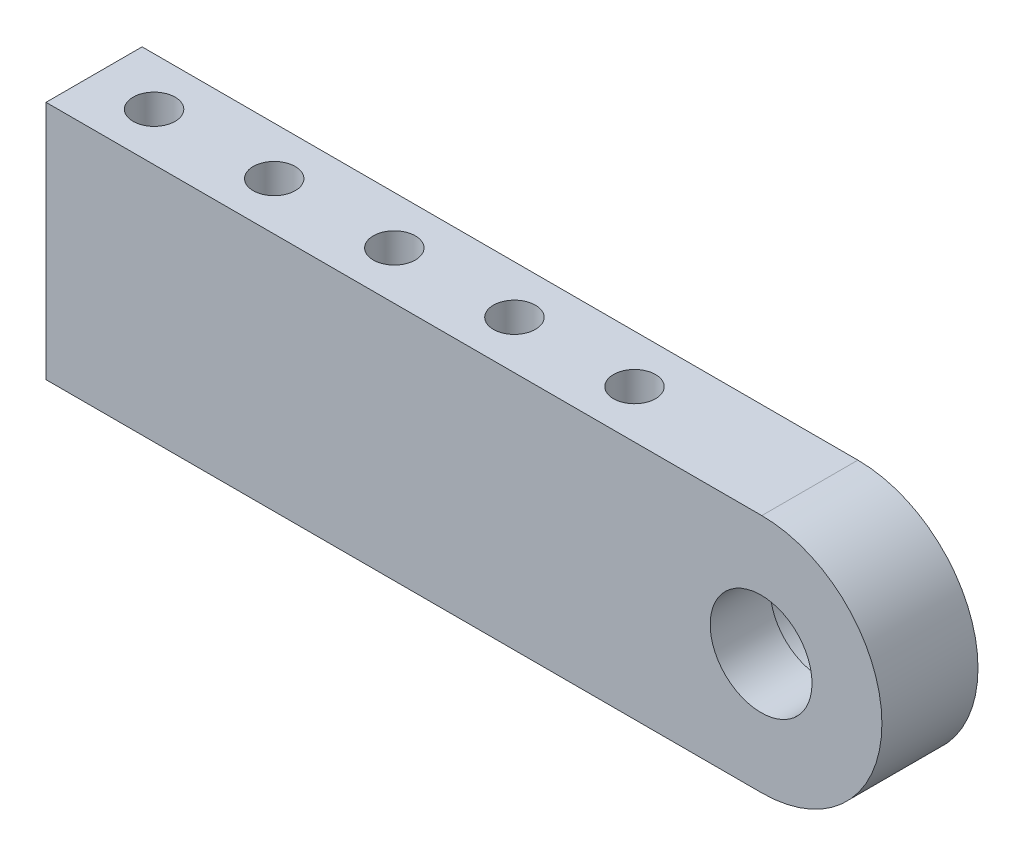
ISO-10303-21;
HEADER;
FILE_DESCRIPTION(('STEP AP214'),'2;1');
FILE_NAME('part.step','',(''),(''),'','','');
FILE_SCHEMA(('AUTOMOTIVE_DESIGN { 1 0 10303 214 1 1 1 1 }'));
ENDSEC;
DATA;
#1=APPLICATION_CONTEXT('core data for automotive mechanical design processes');
#2=APPLICATION_PROTOCOL_DEFINITION('international standard','automotive_design',2000,#1);
#3=PRODUCT_CONTEXT('',#1,'mechanical');
#4=PRODUCT('Part','Part','',(#3));
#5=PRODUCT_RELATED_PRODUCT_CATEGORY('part','',(#4));
#6=PRODUCT_DEFINITION_FORMATION('','',#4);
#7=PRODUCT_DEFINITION_CONTEXT('part definition',#1,'design');
#8=PRODUCT_DEFINITION('design','',#6,#7);
#9=PRODUCT_DEFINITION_SHAPE('','',#8);
#10=(LENGTH_UNIT() NAMED_UNIT(*) SI_UNIT(.MILLI.,.METRE.));
#11=(NAMED_UNIT(*) PLANE_ANGLE_UNIT() SI_UNIT($,.RADIAN.));
#12=(NAMED_UNIT(*) SI_UNIT($,.STERADIAN.) SOLID_ANGLE_UNIT());
#13=UNCERTAINTY_MEASURE_WITH_UNIT(LENGTH_MEASURE(1.E-05),#10,'distance_accuracy_value','');
#14=(GEOMETRIC_REPRESENTATION_CONTEXT(3) GLOBAL_UNCERTAINTY_ASSIGNED_CONTEXT((#13)) GLOBAL_UNIT_ASSIGNED_CONTEXT((#10,
#11,#12)) REPRESENTATION_CONTEXT('',''));
#15=CARTESIAN_POINT('',(0.,0.,0.));
#16=DIRECTION('',(0.,0.,1.));
#17=DIRECTION('',(1.,0.,0.));
#18=AXIS2_PLACEMENT_3D('',#15,#16,#17);
#19=CARTESIAN_POINT('',(0.,0.,0.));
#20=DIRECTION('',(0.,0.,-1.));
#21=DIRECTION('',(-1.,0.,0.));
#22=AXIS2_PLACEMENT_3D('',#19,#20,#21);
#23=PLANE('',#22);
#24=CARTESIAN_POINT('',(0.,0.,0.));
#25=DIRECTION('',(0.,0.,1.));
#26=DIRECTION('',(-1.,0.,0.));
#27=AXIS2_PLACEMENT_3D('',#24,#25,#26);
#28=CIRCLE('',#27,10.);
#29=CARTESIAN_POINT('',(0.,-10.,0.));
#30=VERTEX_POINT('',#29);
#31=CARTESIAN_POINT('',(0.,10.,0.));
#32=VERTEX_POINT('',#31);
#33=EDGE_CURVE('E110',#30,#32,#28,.T.);
#34=ORIENTED_EDGE('',*,*,#33,.F.);
#35=DIRECTION('',(1.,0.,0.));
#36=VECTOR('',#35,1.);
#37=CARTESIAN_POINT('',(-59.6,-10.,0.));
#38=LINE('',#37,#36);
#39=CARTESIAN_POINT('',(-59.6,-10.,0.));
#40=VERTEX_POINT('',#39);
#41=EDGE_CURVE('E48',#40,#30,#38,.T.);
#42=ORIENTED_EDGE('',*,*,#41,.F.);
#43=DIRECTION('',(0.,-1.,0.));
#44=VECTOR('',#43,1.);
#45=CARTESIAN_POINT('',(-59.6,10.,0.));
#46=LINE('',#45,#44);
#47=CARTESIAN_POINT('',(-59.6,10.,0.));
#48=VERTEX_POINT('',#47);
#49=EDGE_CURVE('E56',#48,#40,#46,.T.);
#50=ORIENTED_EDGE('',*,*,#49,.F.);
#51=DIRECTION('',(-1.,0.,0.));
#52=VECTOR('',#51,1.);
#53=CARTESIAN_POINT('',(0.,10.,0.));
#54=LINE('',#53,#52);
#55=EDGE_CURVE('E112',#32,#48,#54,.T.);
#56=ORIENTED_EDGE('',*,*,#55,.F.);
#57=EDGE_LOOP('',(#34,#42,#50,#56));
#58=FACE_BOUND('',#57,.T.);
#59=CARTESIAN_POINT('',(0.,0.,0.));
#60=DIRECTION('',(0.,0.,1.));
#61=DIRECTION('',(1.,0.,0.));
#62=AXIS2_PLACEMENT_3D('',#59,#60,#61);
#63=CIRCLE('',#62,5.3);
#64=CARTESIAN_POINT('',(5.3,0.,0.));
#65=VERTEX_POINT('',#64);
#66=EDGE_CURVE('E107',#65,#65,#63,.T.);
#67=ORIENTED_EDGE('',*,*,#66,.T.);
#68=EDGE_LOOP('',(#67));
#69=FACE_BOUND('',#68,.T.);
#70=ADVANCED_FACE('F33',(#58,#69),#23,.T.);
#71=CARTESIAN_POINT('',(0.,0.,3.));
#72=DIRECTION('',(0.,0.,-1.));
#73=DIRECTION('',(-1.,0.,0.));
#74=AXIS2_PLACEMENT_3D('',#71,#72,#73);
#75=CYLINDRICAL_SURFACE('',#74,10.);
#76=ORIENTED_EDGE('',*,*,#33,.T.);
#77=DIRECTION('',(0.,0.,-1.));
#78=VECTOR('',#77,1.);
#79=CARTESIAN_POINT('',(0.,10.,3.));
#80=LINE('',#79,#78);
#81=CARTESIAN_POINT('',(0.,10.,8.));
#82=VERTEX_POINT('',#81);
#83=EDGE_CURVE('E11',#82,#32,#80,.T.);
#84=ORIENTED_EDGE('',*,*,#83,.F.);
#85=CARTESIAN_POINT('',(0.,0.,8.));
#86=DIRECTION('',(0.,0.,1.));
#87=DIRECTION('',(1.,0.,0.));
#88=AXIS2_PLACEMENT_3D('',#85,#86,#87);
#89=CIRCLE('',#88,10.);
#90=CARTESIAN_POINT('',(0.,-10.,8.));
#91=VERTEX_POINT('',#90);
#92=EDGE_CURVE('E84',#91,#82,#89,.T.);
#93=ORIENTED_EDGE('',*,*,#92,.F.);
#94=DIRECTION('',(0.,0.,-1.));
#95=VECTOR('',#94,1.);
#96=CARTESIAN_POINT('',(0.,-10.,3.));
#97=LINE('',#96,#95);
#98=EDGE_CURVE('E73',#91,#30,#97,.T.);
#99=ORIENTED_EDGE('',*,*,#98,.T.);
#100=EDGE_LOOP('',(#76,#84,#93,#99));
#101=FACE_BOUND('',#100,.T.);
#102=ADVANCED_FACE('F35',(#101),#75,.T.);
#103=CARTESIAN_POINT('',(0.,10.,3.));
#104=DIRECTION('',(0.,-1.,0.));
#105=DIRECTION('',(1.,0.,0.));
#106=AXIS2_PLACEMENT_3D('',#103,#104,#105);
#107=PLANE('',#106);
#108=CARTESIAN_POINT('',(-44.6,10.,4.));
#109=DIRECTION('',(0.,1.,0.));
#110=DIRECTION('',(-1.,0.,0.));
#111=AXIS2_PLACEMENT_3D('',#108,#109,#110);
#112=CIRCLE('',#111,1.75);
#113=CARTESIAN_POINT('',(-46.35,10.,4.));
#114=VERTEX_POINT('',#113);
#115=EDGE_CURVE('E183',#114,#114,#112,.T.);
#116=ORIENTED_EDGE('',*,*,#115,.F.);
#117=EDGE_LOOP('',(#116));
#118=FACE_BOUND('',#117,.T.);
#119=CARTESIAN_POINT('',(-34.6,10.,4.));
#120=DIRECTION('',(0.,1.,0.));
#121=DIRECTION('',(-1.,0.,0.));
#122=AXIS2_PLACEMENT_3D('',#119,#120,#121);
#123=CIRCLE('',#122,1.75);
#124=CARTESIAN_POINT('',(-36.35,10.,4.));
#125=VERTEX_POINT('',#124);
#126=EDGE_CURVE('E179',#125,#125,#123,.T.);
#127=ORIENTED_EDGE('',*,*,#126,.F.);
#128=EDGE_LOOP('',(#127));
#129=FACE_BOUND('',#128,.T.);
#130=CARTESIAN_POINT('',(-24.6,10.,4.));
#131=DIRECTION('',(0.,1.,0.));
#132=DIRECTION('',(-1.,0.,0.));
#133=AXIS2_PLACEMENT_3D('',#130,#131,#132);
#134=CIRCLE('',#133,1.75);
#135=CARTESIAN_POINT('',(-26.35,10.,4.));
#136=VERTEX_POINT('',#135);
#137=EDGE_CURVE('E175',#136,#136,#134,.T.);
#138=ORIENTED_EDGE('',*,*,#137,.F.);
#139=EDGE_LOOP('',(#138));
#140=FACE_BOUND('',#139,.T.);
#141=CARTESIAN_POINT('',(-14.6,10.,4.));
#142=DIRECTION('',(0.,1.,0.));
#143=DIRECTION('',(-1.,0.,0.));
#144=AXIS2_PLACEMENT_3D('',#141,#142,#143);
#145=CIRCLE('',#144,1.75);
#146=CARTESIAN_POINT('',(-16.35,10.,4.));
#147=VERTEX_POINT('',#146);
#148=EDGE_CURVE('E171',#147,#147,#145,.T.);
#149=ORIENTED_EDGE('',*,*,#148,.F.);
#150=EDGE_LOOP('',(#149));
#151=FACE_BOUND('',#150,.T.);
#152=CARTESIAN_POINT('',(-54.6,10.,4.));
#153=DIRECTION('',(0.,1.,0.));
#154=DIRECTION('',(-1.,0.,0.));
#155=AXIS2_PLACEMENT_3D('',#152,#153,#154);
#156=CIRCLE('',#155,1.75);
#157=CARTESIAN_POINT('',(-56.35,10.,4.));
#158=VERTEX_POINT('',#157);
#159=EDGE_CURVE('E165',#158,#158,#156,.T.);
#160=ORIENTED_EDGE('',*,*,#159,.F.);
#161=EDGE_LOOP('',(#160));
#162=FACE_BOUND('',#161,.T.);
#163=ORIENTED_EDGE('',*,*,#55,.T.);
#164=DIRECTION('',(0.,0.,-1.));
#165=VECTOR('',#164,1.);
#166=CARTESIAN_POINT('',(-59.6,10.,3.));
#167=LINE('',#166,#165);
#168=CARTESIAN_POINT('',(-59.6,10.,8.));
#169=VERTEX_POINT('',#168);
#170=EDGE_CURVE('E41',#169,#48,#167,.T.);
#171=ORIENTED_EDGE('',*,*,#170,.F.);
#172=DIRECTION('',(-1.,0.,0.));
#173=VECTOR('',#172,1.);
#174=CARTESIAN_POINT('',(0.,10.,8.));
#175=LINE('',#174,#173);
#176=EDGE_CURVE('E88',#82,#169,#175,.T.);
#177=ORIENTED_EDGE('',*,*,#176,.F.);
#178=ORIENTED_EDGE('',*,*,#83,.T.);
#179=EDGE_LOOP('',(#163,#171,#177,#178));
#180=FACE_BOUND('',#179,.T.);
#181=ADVANCED_FACE('F120',(#118,#129,#140,#151,#162,#180),#107,.F.);
#182=CARTESIAN_POINT('',(-59.6,10.,3.));
#183=DIRECTION('',(1.,0.,0.));
#184=DIRECTION('',(0.,0.,-1.));
#185=AXIS2_PLACEMENT_3D('',#182,#183,#184);
#186=PLANE('',#185);
#187=ORIENTED_EDGE('',*,*,#49,.T.);
#188=DIRECTION('',(0.,0.,-1.));
#189=VECTOR('',#188,1.);
#190=CARTESIAN_POINT('',(-59.6,-10.,3.));
#191=LINE('',#190,#189);
#192=CARTESIAN_POINT('',(-59.6,-10.,8.));
#193=VERTEX_POINT('',#192);
#194=EDGE_CURVE('E81',#193,#40,#191,.T.);
#195=ORIENTED_EDGE('',*,*,#194,.F.);
#196=DIRECTION('',(0.,-1.,0.));
#197=VECTOR('',#196,1.);
#198=CARTESIAN_POINT('',(-59.6,10.,8.));
#199=LINE('',#198,#197);
#200=EDGE_CURVE('E94',#169,#193,#199,.T.);
#201=ORIENTED_EDGE('',*,*,#200,.F.);
#202=ORIENTED_EDGE('',*,*,#170,.T.);
#203=EDGE_LOOP('',(#187,#195,#201,#202));
#204=FACE_BOUND('',#203,.T.);
#205=ADVANCED_FACE('F116',(#204),#186,.F.);
#206=CARTESIAN_POINT('',(-59.6,-10.,3.));
#207=DIRECTION('',(0.,1.,0.));
#208=DIRECTION('',(-1.,0.,0.));
#209=AXIS2_PLACEMENT_3D('',#206,#207,#208);
#210=PLANE('',#209);
#211=CARTESIAN_POINT('',(-44.6,-10.,4.));
#212=DIRECTION('',(0.,1.,0.));
#213=DIRECTION('',(-1.,0.,0.));
#214=AXIS2_PLACEMENT_3D('',#211,#212,#213);
#215=CIRCLE('',#214,1.75);
#216=CARTESIAN_POINT('',(-46.35,-10.,4.));
#217=VERTEX_POINT('',#216);
#218=EDGE_CURVE('E148',#217,#217,#215,.T.);
#219=ORIENTED_EDGE('',*,*,#218,.T.);
#220=EDGE_LOOP('',(#219));
#221=FACE_BOUND('',#220,.T.);
#222=CARTESIAN_POINT('',(-34.6,-10.,4.));
#223=DIRECTION('',(0.,1.,0.));
#224=DIRECTION('',(-1.,0.,0.));
#225=AXIS2_PLACEMENT_3D('',#222,#223,#224);
#226=CIRCLE('',#225,1.75);
#227=CARTESIAN_POINT('',(-36.35,-10.,4.));
#228=VERTEX_POINT('',#227);
#229=EDGE_CURVE('E152',#228,#228,#226,.T.);
#230=ORIENTED_EDGE('',*,*,#229,.T.);
#231=EDGE_LOOP('',(#230));
#232=FACE_BOUND('',#231,.T.);
#233=CARTESIAN_POINT('',(-24.6,-10.,4.));
#234=DIRECTION('',(0.,1.,0.));
#235=DIRECTION('',(-1.,0.,0.));
#236=AXIS2_PLACEMENT_3D('',#233,#234,#235);
#237=CIRCLE('',#236,1.75);
#238=CARTESIAN_POINT('',(-26.35,-10.,4.));
#239=VERTEX_POINT('',#238);
#240=EDGE_CURVE('E156',#239,#239,#237,.T.);
#241=ORIENTED_EDGE('',*,*,#240,.T.);
#242=EDGE_LOOP('',(#241));
#243=FACE_BOUND('',#242,.T.);
#244=CARTESIAN_POINT('',(-14.6,-10.,4.));
#245=DIRECTION('',(0.,1.,0.));
#246=DIRECTION('',(-1.,0.,0.));
#247=AXIS2_PLACEMENT_3D('',#244,#245,#246);
#248=CIRCLE('',#247,1.75);
#249=CARTESIAN_POINT('',(-16.35,-10.,4.));
#250=VERTEX_POINT('',#249);
#251=EDGE_CURVE('E160',#250,#250,#248,.T.);
#252=ORIENTED_EDGE('',*,*,#251,.T.);
#253=EDGE_LOOP('',(#252));
#254=FACE_BOUND('',#253,.T.);
#255=CARTESIAN_POINT('',(-54.6,-10.,4.));
#256=DIRECTION('',(0.,1.,0.));
#257=DIRECTION('',(-1.,0.,0.));
#258=AXIS2_PLACEMENT_3D('',#255,#256,#257);
#259=CIRCLE('',#258,1.75);
#260=CARTESIAN_POINT('',(-56.35,-10.,4.));
#261=VERTEX_POINT('',#260);
#262=EDGE_CURVE('E163',#261,#261,#259,.T.);
#263=ORIENTED_EDGE('',*,*,#262,.T.);
#264=EDGE_LOOP('',(#263));
#265=FACE_BOUND('',#264,.T.);
#266=ORIENTED_EDGE('',*,*,#41,.T.);
#267=ORIENTED_EDGE('',*,*,#98,.F.);
#268=DIRECTION('',(1.,0.,0.));
#269=VECTOR('',#268,1.);
#270=CARTESIAN_POINT('',(-59.6,-10.,8.));
#271=LINE('',#270,#269);
#272=EDGE_CURVE('E77',#193,#91,#271,.T.);
#273=ORIENTED_EDGE('',*,*,#272,.F.);
#274=ORIENTED_EDGE('',*,*,#194,.T.);
#275=EDGE_LOOP('',(#266,#267,#273,#274));
#276=FACE_BOUND('',#275,.T.);
#277=ADVANCED_FACE('F75',(#221,#232,#243,#254,#265,#276),#210,.F.);
#278=CARTESIAN_POINT('',(0.,0.,3.));
#279=DIRECTION('',(0.,0.,-1.));
#280=DIRECTION('',(-1.,0.,0.));
#281=AXIS2_PLACEMENT_3D('',#278,#279,#280);
#282=CYLINDRICAL_SURFACE('',#281,5.3);
#283=CARTESIAN_POINT('',(0.,0.,3.));
#284=DIRECTION('',(0.,0.,1.));
#285=DIRECTION('',(1.,0.,0.));
#286=AXIS2_PLACEMENT_3D('',#283,#284,#285);
#287=CIRCLE('',#286,5.3);
#288=CARTESIAN_POINT('',(5.3,0.,3.));
#289=VERTEX_POINT('',#288);
#290=EDGE_CURVE('E104',#289,#289,#287,.T.);
#291=ORIENTED_EDGE('',*,*,#290,.T.);
#292=EDGE_LOOP('',(#291));
#293=FACE_BOUND('',#292,.T.);
#294=ORIENTED_EDGE('',*,*,#66,.F.);
#295=EDGE_LOOP('',(#294));
#296=FACE_BOUND('',#295,.T.);
#297=ADVANCED_FACE('F136',(#293,#296),#282,.F.);
#298=CARTESIAN_POINT('',(0.,0.,3.));
#299=DIRECTION('',(0.,0.,1.));
#300=DIRECTION('',(1.,0.,0.));
#301=AXIS2_PLACEMENT_3D('',#298,#299,#300);
#302=PLANE('',#301);
#303=CARTESIAN_POINT('',(-0.0603015257437068,0.,3.));
#304=DIRECTION('',(0.,0.,1.));
#305=DIRECTION('',(1.,0.,0.));
#306=AXIS2_PLACEMENT_3D('',#303,#304,#305);
#307=CIRCLE('',#306,4.23969847425629);
#308=CARTESIAN_POINT('',(4.17939694851259,0.,3.));
#309=VERTEX_POINT('',#308);
#310=EDGE_CURVE('E98',#309,#309,#307,.T.);
#311=ORIENTED_EDGE('',*,*,#310,.T.);
#312=EDGE_LOOP('',(#311));
#313=FACE_BOUND('',#312,.T.);
#314=ORIENTED_EDGE('',*,*,#290,.F.);
#315=EDGE_LOOP('',(#314));
#316=FACE_BOUND('',#315,.T.);
#317=ADVANCED_FACE('F143',(#313,#316),#302,.F.);
#318=CARTESIAN_POINT('',(0.,0.,8.));
#319=DIRECTION('',(0.,0.,1.));
#320=DIRECTION('',(1.,0.,0.));
#321=AXIS2_PLACEMENT_3D('',#318,#319,#320);
#322=PLANE('',#321);
#323=ORIENTED_EDGE('',*,*,#272,.T.);
#324=ORIENTED_EDGE('',*,*,#92,.T.);
#325=ORIENTED_EDGE('',*,*,#176,.T.);
#326=ORIENTED_EDGE('',*,*,#200,.T.);
#327=EDGE_LOOP('',(#323,#324,#325,#326));
#328=FACE_BOUND('',#327,.T.);
#329=CARTESIAN_POINT('',(-0.0603015257437068,0.,8.));
#330=DIRECTION('',(0.,0.,1.));
#331=DIRECTION('',(1.,0.,0.));
#332=AXIS2_PLACEMENT_3D('',#329,#330,#331);
#333=CIRCLE('',#332,4.23969847425629);
#334=CARTESIAN_POINT('',(4.17939694851259,0.,8.));
#335=VERTEX_POINT('',#334);
#336=EDGE_CURVE('E95',#335,#335,#333,.T.);
#337=ORIENTED_EDGE('',*,*,#336,.F.);
#338=EDGE_LOOP('',(#337));
#339=FACE_BOUND('',#338,.T.);
#340=ADVANCED_FACE('F91',(#328,#339),#322,.T.);
#341=CARTESIAN_POINT('',(-0.0603015257437068,0.,8.));
#342=DIRECTION('',(0.,0.,-1.));
#343=DIRECTION('',(-1.,0.,0.));
#344=AXIS2_PLACEMENT_3D('',#341,#342,#343);
#345=CYLINDRICAL_SURFACE('',#344,4.23969847425629);
#346=ORIENTED_EDGE('',*,*,#336,.T.);
#347=EDGE_LOOP('',(#346));
#348=FACE_BOUND('',#347,.T.);
#349=ORIENTED_EDGE('',*,*,#310,.F.);
#350=EDGE_LOOP('',(#349));
#351=FACE_BOUND('',#350,.T.);
#352=ADVANCED_FACE('F209',(#348,#351),#345,.F.);
#353=CARTESIAN_POINT('',(-54.6,-10.,4.));
#354=DIRECTION('',(0.,1.,0.));
#355=DIRECTION('',(-1.,0.,0.));
#356=AXIS2_PLACEMENT_3D('',#353,#354,#355);
#357=CYLINDRICAL_SURFACE('',#356,1.75);
#358=CARTESIAN_POINT('',(-56.35,-10.,4.));
#359=CARTESIAN_POINT('',(-56.35,-9.79166666666668,4.));
#360=CARTESIAN_POINT('',(-56.35,-9.58333333333334,4.));
#361=CARTESIAN_POINT('',(-56.35,-9.16666666666668,4.));
#362=CARTESIAN_POINT('',(-56.35,-8.95833333333334,4.));
#363=CARTESIAN_POINT('',(-56.35,-8.54166666666668,4.));
#364=CARTESIAN_POINT('',(-56.35,-8.33333333333334,4.));
#365=CARTESIAN_POINT('',(-56.35,-7.91666666666668,4.));
#366=CARTESIAN_POINT('',(-56.35,-7.70833333333334,4.));
#367=CARTESIAN_POINT('',(-56.35,-7.29166666666668,4.));
#368=CARTESIAN_POINT('',(-56.35,-7.08333333333334,4.));
#369=CARTESIAN_POINT('',(-56.35,-6.66666666666668,4.));
#370=CARTESIAN_POINT('',(-56.35,-6.45833333333334,4.));
#371=CARTESIAN_POINT('',(-56.35,-6.04166666666668,4.));
#372=CARTESIAN_POINT('',(-56.35,-5.83333333333334,4.));
#373=CARTESIAN_POINT('',(-56.35,-5.41666666666668,4.));
#374=CARTESIAN_POINT('',(-56.35,-5.20833333333334,4.));
#375=CARTESIAN_POINT('',(-56.35,-4.79166666666668,4.));
#376=CARTESIAN_POINT('',(-56.35,-4.58333333333334,4.));
#377=CARTESIAN_POINT('',(-56.35,-4.16666666666667,4.));
#378=CARTESIAN_POINT('',(-56.35,-3.95833333333334,4.));
#379=CARTESIAN_POINT('',(-56.35,-3.54166666666667,4.));
#380=CARTESIAN_POINT('',(-56.35,-3.33333333333334,4.));
#381=CARTESIAN_POINT('',(-56.35,-2.91666666666668,4.));
#382=CARTESIAN_POINT('',(-56.35,-2.70833333333334,4.));
#383=CARTESIAN_POINT('',(-56.35,-2.29166666666668,4.));
#384=CARTESIAN_POINT('',(-56.35,-2.08333333333334,4.));
#385=CARTESIAN_POINT('',(-56.35,-1.66666666666668,4.));
#386=CARTESIAN_POINT('',(-56.35,-1.45833333333334,4.));
#387=CARTESIAN_POINT('',(-56.35,-1.04166666666668,4.));
#388=CARTESIAN_POINT('',(-56.35,-0.833333333333343,4.));
#389=CARTESIAN_POINT('',(-56.35,-0.416666666666676,4.));
#390=CARTESIAN_POINT('',(-56.35,-0.208333333333342,4.));
#391=CARTESIAN_POINT('',(-56.35,0.208333333333325,4.));
#392=CARTESIAN_POINT('',(-56.35,0.416666666666658,4.));
#393=CARTESIAN_POINT('',(-56.35,0.833333333333325,4.));
#394=CARTESIAN_POINT('',(-56.35,1.04166666666666,4.));
#395=CARTESIAN_POINT('',(-56.35,1.45833333333333,4.));
#396=CARTESIAN_POINT('',(-56.35,1.66666666666666,4.));
#397=CARTESIAN_POINT('',(-56.35,2.08333333333333,4.));
#398=CARTESIAN_POINT('',(-56.35,2.29166666666666,4.));
#399=CARTESIAN_POINT('',(-56.35,2.70833333333333,4.));
#400=CARTESIAN_POINT('',(-56.35,2.91666666666666,4.));
#401=CARTESIAN_POINT('',(-56.35,3.33333333333333,4.));
#402=CARTESIAN_POINT('',(-56.35,3.54166666666666,4.));
#403=CARTESIAN_POINT('',(-56.35,3.95833333333333,4.));
#404=CARTESIAN_POINT('',(-56.35,4.16666666666666,4.));
#405=CARTESIAN_POINT('',(-56.35,4.58333333333333,4.));
#406=CARTESIAN_POINT('',(-56.35,4.79166666666666,4.));
#407=CARTESIAN_POINT('',(-56.35,5.20833333333333,4.));
#408=CARTESIAN_POINT('',(-56.35,5.41666666666666,4.));
#409=CARTESIAN_POINT('',(-56.35,5.83333333333333,4.));
#410=CARTESIAN_POINT('',(-56.35,6.04166666666666,4.));
#411=CARTESIAN_POINT('',(-56.35,6.45833333333333,4.));
#412=CARTESIAN_POINT('',(-56.35,6.66666666666666,4.));
#413=CARTESIAN_POINT('',(-56.35,7.08333333333333,4.));
#414=CARTESIAN_POINT('',(-56.35,7.29166666666666,4.));
#415=CARTESIAN_POINT('',(-56.35,7.70833333333333,4.));
#416=CARTESIAN_POINT('',(-56.35,7.91666666666666,4.));
#417=CARTESIAN_POINT('',(-56.35,8.33333333333333,4.));
#418=CARTESIAN_POINT('',(-56.35,8.54166666666666,4.));
#419=CARTESIAN_POINT('',(-56.35,8.95833333333333,4.));
#420=CARTESIAN_POINT('',(-56.35,9.16666666666666,4.));
#421=CARTESIAN_POINT('',(-56.35,9.58333333333333,4.));
#422=CARTESIAN_POINT('',(-56.35,9.79166666666666,4.));
#423=CARTESIAN_POINT('',(-56.35,10.,4.));
#424=B_SPLINE_CURVE_WITH_KNOTS('',3,(#358,#359,#360,#361,#362,#363,#364,#365,#366,#367,#368,
#369,#370,#371,#372,#373,#374,#375,#376,#377,#378,#379,#380,#381,#382,#383,#384,#385,#386,#387,
#388,#389,#390,#391,#392,#393,#394,#395,#396,#397,#398,#399,#400,#401,#402,#403,#404,#405,#406,
#407,#408,#409,#410,#411,#412,#413,#414,#415,#416,#417,#418,#419,#420,#421,#422,#423),
.UNSPECIFIED.,.F.,.F.,(4,2,2,2,2,2,2,2,2,2,2,2,2,2,2,2,2,2,2,2,2,2,2,2,2,2,2,2,2,2,2,2,4),(0.,
0.625000000000001,1.25,1.875,2.5,3.125,3.75,4.375,5.,5.625,6.25,6.875,7.5,8.125,8.75,9.375,10.,
10.625,11.25,11.875,12.5,13.125,13.75,14.375,15.,15.625,16.25,16.875,17.5,18.125,18.75,19.375,
20.),.UNSPECIFIED.);
#425=EDGE_CURVE('BSEAM205',#261,#158,#424,.T.);
#426=ORIENTED_EDGE('',*,*,#262,.F.);
#427=ORIENTED_EDGE('',*,*,#159,.T.);
#428=ORIENTED_EDGE('',*,*,#425,.T.);
#429=ORIENTED_EDGE('',*,*,#425,.F.);
#430=EDGE_LOOP('',(#426,#428,#427,#429));
#431=FACE_BOUND('',#430,.T.);
#432=ADVANCED_FACE('F205',(#431),#357,.F.);
#433=CARTESIAN_POINT('',(-14.6,-10.,4.));
#434=DIRECTION('',(0.,1.,0.));
#435=DIRECTION('',(-1.,0.,0.));
#436=AXIS2_PLACEMENT_3D('',#433,#434,#435);
#437=CYLINDRICAL_SURFACE('',#436,1.75);
#438=CARTESIAN_POINT('',(-16.35,-10.,4.));
#439=CARTESIAN_POINT('',(-16.35,-9.79166666666668,4.));
#440=CARTESIAN_POINT('',(-16.35,-9.58333333333334,4.));
#441=CARTESIAN_POINT('',(-16.35,-9.16666666666667,4.));
#442=CARTESIAN_POINT('',(-16.35,-8.95833333333334,4.));
#443=CARTESIAN_POINT('',(-16.35,-8.54166666666667,4.));
#444=CARTESIAN_POINT('',(-16.35,-8.33333333333334,4.));
#445=CARTESIAN_POINT('',(-16.35,-7.91666666666667,4.));
#446=CARTESIAN_POINT('',(-16.35,-7.70833333333334,4.));
#447=CARTESIAN_POINT('',(-16.35,-7.29166666666667,4.));
#448=CARTESIAN_POINT('',(-16.35,-7.08333333333334,4.));
#449=CARTESIAN_POINT('',(-16.35,-6.66666666666667,4.));
#450=CARTESIAN_POINT('',(-16.35,-6.45833333333334,4.));
#451=CARTESIAN_POINT('',(-16.35,-6.04166666666667,4.));
#452=CARTESIAN_POINT('',(-16.35,-5.83333333333334,4.));
#453=CARTESIAN_POINT('',(-16.35,-5.41666666666667,4.));
#454=CARTESIAN_POINT('',(-16.35,-5.20833333333334,4.));
#455=CARTESIAN_POINT('',(-16.35,-4.79166666666667,4.));
#456=CARTESIAN_POINT('',(-16.35,-4.58333333333334,4.));
#457=CARTESIAN_POINT('',(-16.35,-4.16666666666667,4.));
#458=CARTESIAN_POINT('',(-16.35,-3.95833333333334,4.));
#459=CARTESIAN_POINT('',(-16.35,-3.54166666666667,4.));
#460=CARTESIAN_POINT('',(-16.35,-3.33333333333334,4.));
#461=CARTESIAN_POINT('',(-16.35,-2.91666666666667,4.));
#462=CARTESIAN_POINT('',(-16.35,-2.70833333333334,4.));
#463=CARTESIAN_POINT('',(-16.35,-2.29166666666667,4.));
#464=CARTESIAN_POINT('',(-16.35,-2.08333333333334,4.));
#465=CARTESIAN_POINT('',(-16.35,-1.66666666666667,4.));
#466=CARTESIAN_POINT('',(-16.35,-1.45833333333334,4.));
#467=CARTESIAN_POINT('',(-16.35,-1.04166666666667,4.));
#468=CARTESIAN_POINT('',(-16.35,-0.833333333333339,4.));
#469=CARTESIAN_POINT('',(-16.35,-0.416666666666672,4.));
#470=CARTESIAN_POINT('',(-16.35,-0.208333333333339,4.));
#471=CARTESIAN_POINT('',(-16.35,0.208333333333328,4.));
#472=CARTESIAN_POINT('',(-16.35,0.416666666666662,4.));
#473=CARTESIAN_POINT('',(-16.35,0.833333333333329,4.));
#474=CARTESIAN_POINT('',(-16.35,1.04166666666666,4.));
#475=CARTESIAN_POINT('',(-16.35,1.45833333333333,4.));
#476=CARTESIAN_POINT('',(-16.35,1.66666666666666,4.));
#477=CARTESIAN_POINT('',(-16.35,2.08333333333333,4.));
#478=CARTESIAN_POINT('',(-16.35,2.29166666666666,4.));
#479=CARTESIAN_POINT('',(-16.35,2.70833333333333,4.));
#480=CARTESIAN_POINT('',(-16.35,2.91666666666666,4.));
#481=CARTESIAN_POINT('',(-16.35,3.33333333333333,4.));
#482=CARTESIAN_POINT('',(-16.35,3.54166666666666,4.));
#483=CARTESIAN_POINT('',(-16.35,3.95833333333333,4.));
#484=CARTESIAN_POINT('',(-16.35,4.16666666666666,4.));
#485=CARTESIAN_POINT('',(-16.35,4.58333333333333,4.));
#486=CARTESIAN_POINT('',(-16.35,4.79166666666666,4.));
#487=CARTESIAN_POINT('',(-16.35,5.20833333333333,4.));
#488=CARTESIAN_POINT('',(-16.35,5.41666666666666,4.));
#489=CARTESIAN_POINT('',(-16.35,5.83333333333333,4.));
#490=CARTESIAN_POINT('',(-16.35,6.04166666666666,4.));
#491=CARTESIAN_POINT('',(-16.35,6.45833333333333,4.));
#492=CARTESIAN_POINT('',(-16.35,6.66666666666666,4.));
#493=CARTESIAN_POINT('',(-16.35,7.08333333333333,4.));
#494=CARTESIAN_POINT('',(-16.35,7.29166666666666,4.));
#495=CARTESIAN_POINT('',(-16.35,7.70833333333333,4.));
#496=CARTESIAN_POINT('',(-16.35,7.91666666666667,4.));
#497=CARTESIAN_POINT('',(-16.35,8.33333333333333,4.));
#498=CARTESIAN_POINT('',(-16.35,8.54166666666667,4.));
#499=CARTESIAN_POINT('',(-16.35,8.95833333333333,4.));
#500=CARTESIAN_POINT('',(-16.35,9.16666666666667,4.));
#501=CARTESIAN_POINT('',(-16.35,9.58333333333333,4.));
#502=CARTESIAN_POINT('',(-16.35,9.79166666666667,4.));
#503=CARTESIAN_POINT('',(-16.35,10.,4.));
#504=B_SPLINE_CURVE_WITH_KNOTS('',3,(#438,#439,#440,#441,#442,#443,#444,#445,#446,#447,#448,
#449,#450,#451,#452,#453,#454,#455,#456,#457,#458,#459,#460,#461,#462,#463,#464,#465,#466,#467,
#468,#469,#470,#471,#472,#473,#474,#475,#476,#477,#478,#479,#480,#481,#482,#483,#484,#485,#486,
#487,#488,#489,#490,#491,#492,#493,#494,#495,#496,#497,#498,#499,#500,#501,#502,#503),
.UNSPECIFIED.,.F.,.F.,(4,2,2,2,2,2,2,2,2,2,2,2,2,2,2,2,2,2,2,2,2,2,2,2,2,2,2,2,2,2,2,2,4),(0.,
0.625000000000001,1.25,1.875,2.5,3.125,3.75,4.375,5.,5.625,6.25,6.875,7.5,8.125,8.75,9.375,10.,
10.625,11.25,11.875,12.5,13.125,13.75,14.375,15.,15.625,16.25,16.875,17.5,18.125,18.75,19.375,
20.),.UNSPECIFIED.);
#505=EDGE_CURVE('BSEAM201',#250,#147,#504,.T.);
#506=ORIENTED_EDGE('',*,*,#251,.F.);
#507=ORIENTED_EDGE('',*,*,#148,.T.);
#508=ORIENTED_EDGE('',*,*,#505,.T.);
#509=ORIENTED_EDGE('',*,*,#505,.F.);
#510=EDGE_LOOP('',(#506,#508,#507,#509));
#511=FACE_BOUND('',#510,.T.);
#512=ADVANCED_FACE('F201',(#511),#437,.F.);
#513=CARTESIAN_POINT('',(-24.6,-10.,4.));
#514=DIRECTION('',(0.,1.,0.));
#515=DIRECTION('',(-1.,0.,0.));
#516=AXIS2_PLACEMENT_3D('',#513,#514,#515);
#517=CYLINDRICAL_SURFACE('',#516,1.75);
#518=CARTESIAN_POINT('',(-26.35,-10.,4.));
#519=CARTESIAN_POINT('',(-26.35,-9.79166666666668,4.));
#520=CARTESIAN_POINT('',(-26.35,-9.58333333333334,4.));
#521=CARTESIAN_POINT('',(-26.35,-9.16666666666667,4.));
#522=CARTESIAN_POINT('',(-26.35,-8.95833333333334,4.));
#523=CARTESIAN_POINT('',(-26.35,-8.54166666666667,4.));
#524=CARTESIAN_POINT('',(-26.35,-8.33333333333334,4.));
#525=CARTESIAN_POINT('',(-26.35,-7.91666666666667,4.));
#526=CARTESIAN_POINT('',(-26.35,-7.70833333333334,4.));
#527=CARTESIAN_POINT('',(-26.35,-7.29166666666667,4.));
#528=CARTESIAN_POINT('',(-26.35,-7.08333333333334,4.));
#529=CARTESIAN_POINT('',(-26.35,-6.66666666666667,4.));
#530=CARTESIAN_POINT('',(-26.35,-6.45833333333334,4.));
#531=CARTESIAN_POINT('',(-26.35,-6.04166666666667,4.));
#532=CARTESIAN_POINT('',(-26.35,-5.83333333333334,4.));
#533=CARTESIAN_POINT('',(-26.35,-5.41666666666667,4.));
#534=CARTESIAN_POINT('',(-26.35,-5.20833333333334,4.));
#535=CARTESIAN_POINT('',(-26.35,-4.79166666666667,4.));
#536=CARTESIAN_POINT('',(-26.35,-4.58333333333334,4.));
#537=CARTESIAN_POINT('',(-26.35,-4.16666666666667,4.));
#538=CARTESIAN_POINT('',(-26.35,-3.95833333333334,4.));
#539=CARTESIAN_POINT('',(-26.35,-3.54166666666667,4.));
#540=CARTESIAN_POINT('',(-26.35,-3.33333333333334,4.));
#541=CARTESIAN_POINT('',(-26.35,-2.91666666666667,4.));
#542=CARTESIAN_POINT('',(-26.35,-2.70833333333334,4.));
#543=CARTESIAN_POINT('',(-26.35,-2.29166666666667,4.));
#544=CARTESIAN_POINT('',(-26.35,-2.08333333333334,4.));
#545=CARTESIAN_POINT('',(-26.35,-1.66666666666667,4.));
#546=CARTESIAN_POINT('',(-26.35,-1.45833333333334,4.));
#547=CARTESIAN_POINT('',(-26.35,-1.04166666666667,4.));
#548=CARTESIAN_POINT('',(-26.35,-0.833333333333339,4.));
#549=CARTESIAN_POINT('',(-26.35,-0.416666666666672,4.));
#550=CARTESIAN_POINT('',(-26.35,-0.208333333333339,4.));
#551=CARTESIAN_POINT('',(-26.35,0.208333333333328,4.));
#552=CARTESIAN_POINT('',(-26.35,0.416666666666662,4.));
#553=CARTESIAN_POINT('',(-26.35,0.833333333333329,4.));
#554=CARTESIAN_POINT('',(-26.35,1.04166666666666,4.));
#555=CARTESIAN_POINT('',(-26.35,1.45833333333333,4.));
#556=CARTESIAN_POINT('',(-26.35,1.66666666666666,4.));
#557=CARTESIAN_POINT('',(-26.35,2.08333333333333,4.));
#558=CARTESIAN_POINT('',(-26.35,2.29166666666666,4.));
#559=CARTESIAN_POINT('',(-26.35,2.70833333333333,4.));
#560=CARTESIAN_POINT('',(-26.35,2.91666666666666,4.));
#561=CARTESIAN_POINT('',(-26.35,3.33333333333333,4.));
#562=CARTESIAN_POINT('',(-26.35,3.54166666666666,4.));
#563=CARTESIAN_POINT('',(-26.35,3.95833333333333,4.));
#564=CARTESIAN_POINT('',(-26.35,4.16666666666666,4.));
#565=CARTESIAN_POINT('',(-26.35,4.58333333333333,4.));
#566=CARTESIAN_POINT('',(-26.35,4.79166666666666,4.));
#567=CARTESIAN_POINT('',(-26.35,5.20833333333333,4.));
#568=CARTESIAN_POINT('',(-26.35,5.41666666666666,4.));
#569=CARTESIAN_POINT('',(-26.35,5.83333333333333,4.));
#570=CARTESIAN_POINT('',(-26.35,6.04166666666666,4.));
#571=CARTESIAN_POINT('',(-26.35,6.45833333333333,4.));
#572=CARTESIAN_POINT('',(-26.35,6.66666666666666,4.));
#573=CARTESIAN_POINT('',(-26.35,7.08333333333333,4.));
#574=CARTESIAN_POINT('',(-26.35,7.29166666666666,4.));
#575=CARTESIAN_POINT('',(-26.35,7.70833333333333,4.));
#576=CARTESIAN_POINT('',(-26.35,7.91666666666667,4.));
#577=CARTESIAN_POINT('',(-26.35,8.33333333333333,4.));
#578=CARTESIAN_POINT('',(-26.35,8.54166666666667,4.));
#579=CARTESIAN_POINT('',(-26.35,8.95833333333333,4.));
#580=CARTESIAN_POINT('',(-26.35,9.16666666666667,4.));
#581=CARTESIAN_POINT('',(-26.35,9.58333333333333,4.));
#582=CARTESIAN_POINT('',(-26.35,9.79166666666667,4.));
#583=CARTESIAN_POINT('',(-26.35,10.,4.));
#584=B_SPLINE_CURVE_WITH_KNOTS('',3,(#518,#519,#520,#521,#522,#523,#524,#525,#526,#527,#528,
#529,#530,#531,#532,#533,#534,#535,#536,#537,#538,#539,#540,#541,#542,#543,#544,#545,#546,#547,
#548,#549,#550,#551,#552,#553,#554,#555,#556,#557,#558,#559,#560,#561,#562,#563,#564,#565,#566,
#567,#568,#569,#570,#571,#572,#573,#574,#575,#576,#577,#578,#579,#580,#581,#582,#583),
.UNSPECIFIED.,.F.,.F.,(4,2,2,2,2,2,2,2,2,2,2,2,2,2,2,2,2,2,2,2,2,2,2,2,2,2,2,2,2,2,2,2,4),(0.,
0.625000000000001,1.25,1.875,2.5,3.125,3.75,4.375,5.,5.625,6.25,6.875,7.5,8.125,8.75,9.375,10.,
10.625,11.25,11.875,12.5,13.125,13.75,14.375,15.,15.625,16.25,16.875,17.5,18.125,18.75,19.375,
20.),.UNSPECIFIED.);
#585=EDGE_CURVE('BSEAM195',#239,#136,#584,.T.);
#586=ORIENTED_EDGE('',*,*,#240,.F.);
#587=ORIENTED_EDGE('',*,*,#137,.T.);
#588=ORIENTED_EDGE('',*,*,#585,.T.);
#589=ORIENTED_EDGE('',*,*,#585,.F.);
#590=EDGE_LOOP('',(#586,#588,#587,#589));
#591=FACE_BOUND('',#590,.T.);
#592=ADVANCED_FACE('F195',(#591),#517,.F.);
#593=CARTESIAN_POINT('',(-34.6,-10.,4.));
#594=DIRECTION('',(0.,1.,0.));
#595=DIRECTION('',(-1.,0.,0.));
#596=AXIS2_PLACEMENT_3D('',#593,#594,#595);
#597=CYLINDRICAL_SURFACE('',#596,1.75);
#598=CARTESIAN_POINT('',(-36.35,-10.,4.));
#599=CARTESIAN_POINT('',(-36.35,-9.79166666666668,4.));
#600=CARTESIAN_POINT('',(-36.35,-9.58333333333334,4.));
#601=CARTESIAN_POINT('',(-36.35,-9.16666666666668,4.));
#602=CARTESIAN_POINT('',(-36.35,-8.95833333333334,4.));
#603=CARTESIAN_POINT('',(-36.35,-8.54166666666668,4.));
#604=CARTESIAN_POINT('',(-36.35,-8.33333333333334,4.));
#605=CARTESIAN_POINT('',(-36.35,-7.91666666666668,4.));
#606=CARTESIAN_POINT('',(-36.35,-7.70833333333334,4.));
#607=CARTESIAN_POINT('',(-36.35,-7.29166666666667,4.));
#608=CARTESIAN_POINT('',(-36.35,-7.08333333333334,4.));
#609=CARTESIAN_POINT('',(-36.35,-6.66666666666667,4.));
#610=CARTESIAN_POINT('',(-36.35,-6.45833333333334,4.));
#611=CARTESIAN_POINT('',(-36.35,-6.04166666666667,4.));
#612=CARTESIAN_POINT('',(-36.35,-5.83333333333334,4.));
#613=CARTESIAN_POINT('',(-36.35,-5.41666666666667,4.));
#614=CARTESIAN_POINT('',(-36.35,-5.20833333333334,4.));
#615=CARTESIAN_POINT('',(-36.35,-4.79166666666667,4.));
#616=CARTESIAN_POINT('',(-36.35,-4.58333333333334,4.));
#617=CARTESIAN_POINT('',(-36.35,-4.16666666666667,4.));
#618=CARTESIAN_POINT('',(-36.35,-3.95833333333334,4.));
#619=CARTESIAN_POINT('',(-36.35,-3.54166666666667,4.));
#620=CARTESIAN_POINT('',(-36.35,-3.33333333333334,4.));
#621=CARTESIAN_POINT('',(-36.35,-2.91666666666667,4.));
#622=CARTESIAN_POINT('',(-36.35,-2.70833333333334,4.));
#623=CARTESIAN_POINT('',(-36.35,-2.29166666666667,4.));
#624=CARTESIAN_POINT('',(-36.35,-2.08333333333334,4.));
#625=CARTESIAN_POINT('',(-36.35,-1.66666666666667,4.));
#626=CARTESIAN_POINT('',(-36.35,-1.45833333333334,4.));
#627=CARTESIAN_POINT('',(-36.35,-1.04166666666667,4.));
#628=CARTESIAN_POINT('',(-36.35,-0.833333333333341,4.));
#629=CARTESIAN_POINT('',(-36.35,-0.416666666666674,4.));
#630=CARTESIAN_POINT('',(-36.35,-0.20833333333334,4.));
#631=CARTESIAN_POINT('',(-36.35,0.208333333333327,4.));
#632=CARTESIAN_POINT('',(-36.35,0.41666666666666,4.));
#633=CARTESIAN_POINT('',(-36.35,0.833333333333327,4.));
#634=CARTESIAN_POINT('',(-36.35,1.04166666666666,4.));
#635=CARTESIAN_POINT('',(-36.35,1.45833333333333,4.));
#636=CARTESIAN_POINT('',(-36.35,1.66666666666666,4.));
#637=CARTESIAN_POINT('',(-36.35,2.08333333333333,4.));
#638=CARTESIAN_POINT('',(-36.35,2.29166666666666,4.));
#639=CARTESIAN_POINT('',(-36.35,2.70833333333333,4.));
#640=CARTESIAN_POINT('',(-36.35,2.91666666666666,4.));
#641=CARTESIAN_POINT('',(-36.35,3.33333333333333,4.));
#642=CARTESIAN_POINT('',(-36.35,3.54166666666666,4.));
#643=CARTESIAN_POINT('',(-36.35,3.95833333333333,4.));
#644=CARTESIAN_POINT('',(-36.35,4.16666666666666,4.));
#645=CARTESIAN_POINT('',(-36.35,4.58333333333333,4.));
#646=CARTESIAN_POINT('',(-36.35,4.79166666666666,4.));
#647=CARTESIAN_POINT('',(-36.35,5.20833333333333,4.));
#648=CARTESIAN_POINT('',(-36.35,5.41666666666666,4.));
#649=CARTESIAN_POINT('',(-36.35,5.83333333333333,4.));
#650=CARTESIAN_POINT('',(-36.35,6.04166666666666,4.));
#651=CARTESIAN_POINT('',(-36.35,6.45833333333333,4.));
#652=CARTESIAN_POINT('',(-36.35,6.66666666666666,4.));
#653=CARTESIAN_POINT('',(-36.35,7.08333333333333,4.));
#654=CARTESIAN_POINT('',(-36.35,7.29166666666666,4.));
#655=CARTESIAN_POINT('',(-36.35,7.70833333333333,4.));
#656=CARTESIAN_POINT('',(-36.35,7.91666666666666,4.));
#657=CARTESIAN_POINT('',(-36.35,8.33333333333333,4.));
#658=CARTESIAN_POINT('',(-36.35,8.54166666666666,4.));
#659=CARTESIAN_POINT('',(-36.35,8.95833333333333,4.));
#660=CARTESIAN_POINT('',(-36.35,9.16666666666666,4.));
#661=CARTESIAN_POINT('',(-36.35,9.58333333333333,4.));
#662=CARTESIAN_POINT('',(-36.35,9.79166666666667,4.));
#663=CARTESIAN_POINT('',(-36.35,10.,4.));
#664=B_SPLINE_CURVE_WITH_KNOTS('',3,(#598,#599,#600,#601,#602,#603,#604,#605,#606,#607,#608,
#609,#610,#611,#612,#613,#614,#615,#616,#617,#618,#619,#620,#621,#622,#623,#624,#625,#626,#627,
#628,#629,#630,#631,#632,#633,#634,#635,#636,#637,#638,#639,#640,#641,#642,#643,#644,#645,#646,
#647,#648,#649,#650,#651,#652,#653,#654,#655,#656,#657,#658,#659,#660,#661,#662,#663),
.UNSPECIFIED.,.F.,.F.,(4,2,2,2,2,2,2,2,2,2,2,2,2,2,2,2,2,2,2,2,2,2,2,2,2,2,2,2,2,2,2,2,4),(0.,
0.625000000000001,1.25,1.875,2.5,3.125,3.75,4.375,5.,5.625,6.25,6.875,7.5,8.125,8.75,9.375,10.,
10.625,11.25,11.875,12.5,13.125,13.75,14.375,15.,15.625,16.25,16.875,17.5,18.125,18.75,19.375,
20.),.UNSPECIFIED.);
#665=EDGE_CURVE('BSEAM189',#228,#125,#664,.T.);
#666=ORIENTED_EDGE('',*,*,#229,.F.);
#667=ORIENTED_EDGE('',*,*,#126,.T.);
#668=ORIENTED_EDGE('',*,*,#665,.T.);
#669=ORIENTED_EDGE('',*,*,#665,.F.);
#670=EDGE_LOOP('',(#666,#668,#667,#669));
#671=FACE_BOUND('',#670,.T.);
#672=ADVANCED_FACE('F189',(#671),#597,.F.);
#673=CARTESIAN_POINT('',(-44.6,-10.,4.));
#674=DIRECTION('',(0.,1.,0.));
#675=DIRECTION('',(-1.,0.,0.));
#676=AXIS2_PLACEMENT_3D('',#673,#674,#675);
#677=CYLINDRICAL_SURFACE('',#676,1.75);
#678=CARTESIAN_POINT('',(-46.35,-10.,4.));
#679=CARTESIAN_POINT('',(-46.35,-9.79166666666668,4.));
#680=CARTESIAN_POINT('',(-46.35,-9.58333333333334,4.));
#681=CARTESIAN_POINT('',(-46.35,-9.16666666666668,4.));
#682=CARTESIAN_POINT('',(-46.35,-8.95833333333334,4.));
#683=CARTESIAN_POINT('',(-46.35,-8.54166666666668,4.));
#684=CARTESIAN_POINT('',(-46.35,-8.33333333333334,4.));
#685=CARTESIAN_POINT('',(-46.35,-7.91666666666668,4.));
#686=CARTESIAN_POINT('',(-46.35,-7.70833333333334,4.));
#687=CARTESIAN_POINT('',(-46.35,-7.29166666666667,4.));
#688=CARTESIAN_POINT('',(-46.35,-7.08333333333334,4.));
#689=CARTESIAN_POINT('',(-46.35,-6.66666666666667,4.));
#690=CARTESIAN_POINT('',(-46.35,-6.45833333333334,4.));
#691=CARTESIAN_POINT('',(-46.35,-6.04166666666667,4.));
#692=CARTESIAN_POINT('',(-46.35,-5.83333333333334,4.));
#693=CARTESIAN_POINT('',(-46.35,-5.41666666666667,4.));
#694=CARTESIAN_POINT('',(-46.35,-5.20833333333334,4.));
#695=CARTESIAN_POINT('',(-46.35,-4.79166666666667,4.));
#696=CARTESIAN_POINT('',(-46.35,-4.58333333333334,4.));
#697=CARTESIAN_POINT('',(-46.35,-4.16666666666667,4.));
#698=CARTESIAN_POINT('',(-46.35,-3.95833333333334,4.));
#699=CARTESIAN_POINT('',(-46.35,-3.54166666666667,4.));
#700=CARTESIAN_POINT('',(-46.35,-3.33333333333334,4.));
#701=CARTESIAN_POINT('',(-46.35,-2.91666666666667,4.));
#702=CARTESIAN_POINT('',(-46.35,-2.70833333333334,4.));
#703=CARTESIAN_POINT('',(-46.35,-2.29166666666667,4.));
#704=CARTESIAN_POINT('',(-46.35,-2.08333333333334,4.));
#705=CARTESIAN_POINT('',(-46.35,-1.66666666666667,4.));
#706=CARTESIAN_POINT('',(-46.35,-1.45833333333334,4.));
#707=CARTESIAN_POINT('',(-46.35,-1.04166666666667,4.));
#708=CARTESIAN_POINT('',(-46.35,-0.833333333333341,4.));
#709=CARTESIAN_POINT('',(-46.35,-0.416666666666674,4.));
#710=CARTESIAN_POINT('',(-46.35,-0.20833333333334,4.));
#711=CARTESIAN_POINT('',(-46.35,0.208333333333327,4.));
#712=CARTESIAN_POINT('',(-46.35,0.41666666666666,4.));
#713=CARTESIAN_POINT('',(-46.35,0.833333333333327,4.));
#714=CARTESIAN_POINT('',(-46.35,1.04166666666666,4.));
#715=CARTESIAN_POINT('',(-46.35,1.45833333333333,4.));
#716=CARTESIAN_POINT('',(-46.35,1.66666666666666,4.));
#717=CARTESIAN_POINT('',(-46.35,2.08333333333333,4.));
#718=CARTESIAN_POINT('',(-46.35,2.29166666666666,4.));
#719=CARTESIAN_POINT('',(-46.35,2.70833333333333,4.));
#720=CARTESIAN_POINT('',(-46.35,2.91666666666666,4.));
#721=CARTESIAN_POINT('',(-46.35,3.33333333333333,4.));
#722=CARTESIAN_POINT('',(-46.35,3.54166666666666,4.));
#723=CARTESIAN_POINT('',(-46.35,3.95833333333333,4.));
#724=CARTESIAN_POINT('',(-46.35,4.16666666666666,4.));
#725=CARTESIAN_POINT('',(-46.35,4.58333333333333,4.));
#726=CARTESIAN_POINT('',(-46.35,4.79166666666666,4.));
#727=CARTESIAN_POINT('',(-46.35,5.20833333333333,4.));
#728=CARTESIAN_POINT('',(-46.35,5.41666666666666,4.));
#729=CARTESIAN_POINT('',(-46.35,5.83333333333333,4.));
#730=CARTESIAN_POINT('',(-46.35,6.04166666666666,4.));
#731=CARTESIAN_POINT('',(-46.35,6.45833333333333,4.));
#732=CARTESIAN_POINT('',(-46.35,6.66666666666666,4.));
#733=CARTESIAN_POINT('',(-46.35,7.08333333333333,4.));
#734=CARTESIAN_POINT('',(-46.35,7.29166666666666,4.));
#735=CARTESIAN_POINT('',(-46.35,7.70833333333333,4.));
#736=CARTESIAN_POINT('',(-46.35,7.91666666666666,4.));
#737=CARTESIAN_POINT('',(-46.35,8.33333333333333,4.));
#738=CARTESIAN_POINT('',(-46.35,8.54166666666666,4.));
#739=CARTESIAN_POINT('',(-46.35,8.95833333333333,4.));
#740=CARTESIAN_POINT('',(-46.35,9.16666666666666,4.));
#741=CARTESIAN_POINT('',(-46.35,9.58333333333333,4.));
#742=CARTESIAN_POINT('',(-46.35,9.79166666666667,4.));
#743=CARTESIAN_POINT('',(-46.35,10.,4.));
#744=B_SPLINE_CURVE_WITH_KNOTS('',3,(#678,#679,#680,#681,#682,#683,#684,#685,#686,#687,#688,
#689,#690,#691,#692,#693,#694,#695,#696,#697,#698,#699,#700,#701,#702,#703,#704,#705,#706,#707,
#708,#709,#710,#711,#712,#713,#714,#715,#716,#717,#718,#719,#720,#721,#722,#723,#724,#725,#726,
#727,#728,#729,#730,#731,#732,#733,#734,#735,#736,#737,#738,#739,#740,#741,#742,#743),
.UNSPECIFIED.,.F.,.F.,(4,2,2,2,2,2,2,2,2,2,2,2,2,2,2,2,2,2,2,2,2,2,2,2,2,2,2,2,2,2,2,2,4),(0.,
0.625000000000001,1.25,1.875,2.5,3.125,3.75,4.375,5.,5.625,6.25,6.875,7.5,8.125,8.75,9.375,10.,
10.625,11.25,11.875,12.5,13.125,13.75,14.375,15.,15.625,16.25,16.875,17.5,18.125,18.75,19.375,
20.),.UNSPECIFIED.);
#745=EDGE_CURVE('BSEAM187',#217,#114,#744,.T.);
#746=ORIENTED_EDGE('',*,*,#218,.F.);
#747=ORIENTED_EDGE('',*,*,#115,.T.);
#748=ORIENTED_EDGE('',*,*,#745,.T.);
#749=ORIENTED_EDGE('',*,*,#745,.F.);
#750=EDGE_LOOP('',(#746,#748,#747,#749));
#751=FACE_BOUND('',#750,.T.);
#752=ADVANCED_FACE('F187',(#751),#677,.F.);
#753=CLOSED_SHELL('',(#70,#102,#181,#205,#277,#297,#317,#340,#352,#432,#512,#592,#672,#752));
#754=MANIFOLD_SOLID_BREP('B2',#753);
#755=ADVANCED_BREP_SHAPE_REPRESENTATION('',(#18,#754),#14);
#756=SHAPE_DEFINITION_REPRESENTATION(#9,#755);
ENDSEC;
END-ISO-10303-21;
